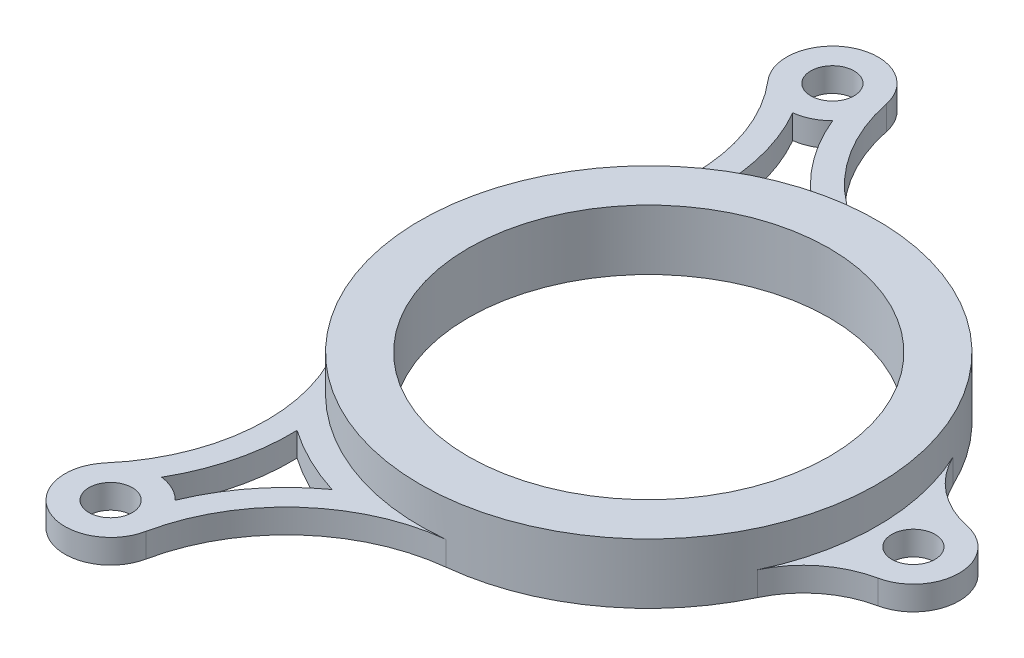
ISO-10303-21;
HEADER;
FILE_DESCRIPTION(('STEP AP214'),'2;1');
FILE_NAME('part.step','',(''),(''),'','','');
FILE_SCHEMA(('AUTOMOTIVE_DESIGN { 1 0 10303 214 1 1 1 1 }'));
ENDSEC;
DATA;
#1=APPLICATION_CONTEXT('core data for automotive mechanical design processes');
#2=APPLICATION_PROTOCOL_DEFINITION('international standard','automotive_design',2000,#1);
#3=PRODUCT_CONTEXT('',#1,'mechanical');
#4=PRODUCT('Part','Part','',(#3));
#5=PRODUCT_RELATED_PRODUCT_CATEGORY('part','',(#4));
#6=PRODUCT_DEFINITION_FORMATION('','',#4);
#7=PRODUCT_DEFINITION_CONTEXT('part definition',#1,'design');
#8=PRODUCT_DEFINITION('design','',#6,#7);
#9=PRODUCT_DEFINITION_SHAPE('','',#8);
#10=(LENGTH_UNIT() NAMED_UNIT(*) SI_UNIT(.MILLI.,.METRE.));
#11=(NAMED_UNIT(*) PLANE_ANGLE_UNIT() SI_UNIT($,.RADIAN.));
#12=(NAMED_UNIT(*) SI_UNIT($,.STERADIAN.) SOLID_ANGLE_UNIT());
#13=UNCERTAINTY_MEASURE_WITH_UNIT(LENGTH_MEASURE(1.E-05),#10,'distance_accuracy_value','');
#14=(GEOMETRIC_REPRESENTATION_CONTEXT(3) GLOBAL_UNCERTAINTY_ASSIGNED_CONTEXT((#13)) GLOBAL_UNIT_ASSIGNED_CONTEXT((#10,
#11,#12)) REPRESENTATION_CONTEXT('',''));
#15=CARTESIAN_POINT('',(0.,0.,0.));
#16=DIRECTION('',(0.,0.,1.));
#17=DIRECTION('',(1.,0.,0.));
#18=AXIS2_PLACEMENT_3D('',#15,#16,#17);
#19=CARTESIAN_POINT('',(0.,6.35,0.));
#20=DIRECTION('',(0.,1.,0.));
#21=DIRECTION('',(0.,0.,1.));
#22=AXIS2_PLACEMENT_3D('',#19,#20,#21);
#23=PLANE('',#22);
#24=CARTESIAN_POINT('',(0.,6.35,0.));
#25=DIRECTION('',(0.,1.,0.));
#26=DIRECTION('',(0.,0.,1.));
#27=AXIS2_PLACEMENT_3D('',#24,#25,#26);
#28=CIRCLE('',#27,24.13);
#29=CARTESIAN_POINT('',(0.,6.35,24.13));
#30=VERTEX_POINT('',#29);
#31=EDGE_CURVE('E50',#30,#30,#28,.T.);
#32=ORIENTED_EDGE('',*,*,#31,.T.);
#33=EDGE_LOOP('',(#32));
#34=FACE_BOUND('',#33,.T.);
#35=CARTESIAN_POINT('',(0.,6.35,0.));
#36=DIRECTION('',(0.,1.,0.));
#37=DIRECTION('',(0.,0.,1.));
#38=AXIS2_PLACEMENT_3D('',#35,#36,#37);
#39=CIRCLE('',#38,19.05);
#40=CARTESIAN_POINT('',(0.,6.35,19.05));
#41=VERTEX_POINT('',#40);
#42=EDGE_CURVE('E406',#41,#41,#39,.T.);
#43=ORIENTED_EDGE('',*,*,#42,.F.);
#44=EDGE_LOOP('',(#43));
#45=FACE_BOUND('',#44,.T.);
#46=ADVANCED_FACE('F41',(#34,#45),#23,.T.);
#47=CARTESIAN_POINT('',(0.,0.,0.));
#48=DIRECTION('',(0.,1.,0.));
#49=DIRECTION('',(0.,0.,1.));
#50=AXIS2_PLACEMENT_3D('',#47,#48,#49);
#51=PLANE('',#50);
#52=CARTESIAN_POINT('',(0.,0.,0.));
#53=DIRECTION('',(0.,1.,0.));
#54=DIRECTION('',(0.,0.,1.));
#55=AXIS2_PLACEMENT_3D('',#52,#53,#54);
#56=CIRCLE('',#55,24.13);
#57=CARTESIAN_POINT('',(21.8096202020202,0.,-10.3246000718494));
#58=VERTEX_POINT('',#57);
#59=CARTESIAN_POINT('',(2.61164424906791,0.,-23.9882515893991));
#60=VERTEX_POINT('',#59);
#61=EDGE_CURVE('E416',#58,#60,#56,.T.);
#62=ORIENTED_EDGE('',*,*,#61,.F.);
#63=CARTESIAN_POINT('',(30.9926181818182,0.,-14.6718001021018));
#64=DIRECTION('',(0.,1.,0.));
#65=DIRECTION('',(0.,0.,-1.));
#66=AXIS2_PLACEMENT_3D('',#63,#64,#65);
#67=CIRCLE('',#66,10.16);
#68=CARTESIAN_POINT('',(28.9230465331279,0.,-4.72481698203277));
#69=VERTEX_POINT('',#68);
#70=EDGE_CURVE('E385',#58,#69,#67,.T.);
#71=ORIENTED_EDGE('',*,*,#70,.T.);
#72=CARTESIAN_POINT('',(27.94,0.,0.));
#73=DIRECTION('',(0.,-1.,0.));
#74=DIRECTION('',(0.,0.,-1.));
#75=AXIS2_PLACEMENT_3D('',#72,#73,#74);
#76=CIRCLE('',#75,4.826);
#77=CARTESIAN_POINT('',(28.9230465331279,0.,4.72481698203277));
#78=VERTEX_POINT('',#77);
#79=EDGE_CURVE('E373',#69,#78,#76,.T.);
#80=ORIENTED_EDGE('',*,*,#79,.T.);
#81=CARTESIAN_POINT('',(30.9926181818182,0.,14.6718001021018));
#82=DIRECTION('',(0.,1.,0.));
#83=DIRECTION('',(0.,0.,-1.));
#84=AXIS2_PLACEMENT_3D('',#81,#82,#83);
#85=CIRCLE('',#84,10.16);
#86=CARTESIAN_POINT('',(21.8096202020202,0.,10.3246000718494));
#87=VERTEX_POINT('',#86);
#88=EDGE_CURVE('E364',#78,#87,#85,.T.);
#89=ORIENTED_EDGE('',*,*,#88,.T.);
#90=CARTESIAN_POINT('',(2.61164424906791,0.,23.9882515893991));
#91=VERTEX_POINT('',#90);
#92=EDGE_CURVE('E410',#91,#87,#56,.T.);
#93=ORIENTED_EDGE('',*,*,#92,.F.);
#94=CARTESIAN_POINT('',(4.67346865622678,0.,42.9263449494511));
#95=DIRECTION('',(0.,-1.,0.));
#96=DIRECTION('',(0.,0.,-1.));
#97=AXIS2_PLACEMENT_3D('',#94,#95,#96);
#98=CIRCLE('',#97,19.05);
#99=CARTESIAN_POINT('',(-13.9832669737414,0.,39.0755378089316));
#100=VERTEX_POINT('',#99);
#101=EDGE_CURVE('E327',#100,#91,#98,.T.);
#102=ORIENTED_EDGE('',*,*,#101,.F.);
#103=CARTESIAN_POINT('',(-18.70964,0.,38.1));
#104=DIRECTION('',(0.,-1.,0.));
#105=DIRECTION('',(0.,0.,-1.));
#106=AXIS2_PLACEMENT_3D('',#103,#104,#105);
#107=CIRCLE('',#106,4.826);
#108=CARTESIAN_POINT('',(-22.3713617674814,0.,34.9564240588857));
#109=VERTEX_POINT('',#108);
#110=EDGE_CURVE('E315',#100,#109,#107,.T.);
#111=ORIENTED_EDGE('',*,*,#110,.T.);
#112=CARTESIAN_POINT('',(-36.8255266391186,0.,22.5475716597502));
#113=DIRECTION('',(0.,-1.,0.));
#114=DIRECTION('',(0.,0.,-1.));
#115=AXIS2_PLACEMENT_3D('',#112,#113,#114);
#116=CIRCLE('',#115,19.05);
#117=CARTESIAN_POINT('',(-20.5789707689192,0.,12.6001135745663));
#118=VERTEX_POINT('',#117);
#119=EDGE_CURVE('E323',#118,#109,#116,.T.);
#120=ORIENTED_EDGE('',*,*,#119,.F.);
#121=CARTESIAN_POINT('',(-20.5789707689192,0.,-12.6001135745663));
#122=VERTEX_POINT('',#121);
#123=EDGE_CURVE('E418',#122,#118,#56,.T.);
#124=ORIENTED_EDGE('',*,*,#123,.F.);
#125=CARTESIAN_POINT('',(-36.8255266391186,0.,-22.5475716597502));
#126=DIRECTION('',(0.,1.,0.));
#127=DIRECTION('',(0.,0.,1.));
#128=AXIS2_PLACEMENT_3D('',#125,#126,#127);
#129=CIRCLE('',#128,19.05);
#130=CARTESIAN_POINT('',(-22.3713617674814,0.,-34.9564240588857));
#131=VERTEX_POINT('',#130);
#132=EDGE_CURVE('E212',#122,#131,#129,.T.);
#133=ORIENTED_EDGE('',*,*,#132,.T.);
#134=CARTESIAN_POINT('',(-18.70964,0.,-38.1));
#135=DIRECTION('',(0.,1.,0.));
#136=DIRECTION('',(0.,0.,1.));
#137=AXIS2_PLACEMENT_3D('',#134,#135,#136);
#138=CIRCLE('',#137,4.826);
#139=CARTESIAN_POINT('',(-13.9832669737414,0.,-39.0755378089316));
#140=VERTEX_POINT('',#139);
#141=EDGE_CURVE('E245',#140,#131,#138,.T.);
#142=ORIENTED_EDGE('',*,*,#141,.F.);
#143=CARTESIAN_POINT('',(4.67346865622678,0.,-42.9263449494511));
#144=DIRECTION('',(0.,1.,0.));
#145=DIRECTION('',(0.,0.,1.));
#146=AXIS2_PLACEMENT_3D('',#143,#144,#145);
#147=CIRCLE('',#146,19.05);
#148=EDGE_CURVE('E246',#140,#60,#147,.T.);
#149=ORIENTED_EDGE('',*,*,#148,.T.);
#150=EDGE_LOOP('',(#62,#71,#80,#89,#93,#102,#111,#120,#124,#133,#142,#149));
#151=FACE_BOUND('',#150,.T.);
#152=CARTESIAN_POINT('',(0.,0.,0.));
#153=DIRECTION('',(0.,1.,0.));
#154=DIRECTION('',(0.,0.,1.));
#155=AXIS2_PLACEMENT_3D('',#152,#153,#154);
#156=CIRCLE('',#155,19.05);
#157=CARTESIAN_POINT('',(0.,0.,19.05));
#158=VERTEX_POINT('',#157);
#159=EDGE_CURVE('E395',#158,#158,#156,.T.);
#160=ORIENTED_EDGE('',*,*,#159,.T.);
#161=EDGE_LOOP('',(#160));
#162=FACE_BOUND('',#161,.T.);
#163=CARTESIAN_POINT('',(27.94,0.,0.));
#164=DIRECTION('',(0.,-1.,0.));
#165=DIRECTION('',(0.,0.,-1.));
#166=AXIS2_PLACEMENT_3D('',#163,#164,#165);
#167=CIRCLE('',#166,2.286);
#168=CARTESIAN_POINT('',(27.94,0.,-2.286));
#169=VERTEX_POINT('',#168);
#170=EDGE_CURVE('E337',#169,#169,#167,.T.);
#171=ORIENTED_EDGE('',*,*,#170,.F.);
#172=EDGE_LOOP('',(#171));
#173=FACE_BOUND('',#172,.T.);
#174=CARTESIAN_POINT('',(-36.8255266391186,0.,22.5475716597502));
#175=DIRECTION('',(0.,-1.,0.));
#176=DIRECTION('',(0.,0.,-1.));
#177=AXIS2_PLACEMENT_3D('',#174,#175,#176);
#178=CIRCLE('',#177,21.59);
#179=CARTESIAN_POINT('',(-15.2457644287689,0.,21.8827687229583));
#180=VERTEX_POINT('',#179);
#181=CARTESIAN_POINT('',(-18.1100697208637,0.,33.311389399797));
#182=VERTEX_POINT('',#181);
#183=EDGE_CURVE('E256',#180,#182,#178,.T.);
#184=ORIENTED_EDGE('',*,*,#183,.T.);
#185=CARTESIAN_POINT('',(-15.286943188986,0.,34.6977327353844));
#186=VERTEX_POINT('',#185);
#187=EDGE_CURVE('E310',#182,#186,#107,.T.);
#188=ORIENTED_EDGE('',*,*,#187,.T.);
#189=CARTESIAN_POINT('',(4.67346865622678,0.,42.9263449494511));
#190=DIRECTION('',(0.,-1.,0.));
#191=DIRECTION('',(0.,0.,-1.));
#192=AXIS2_PLACEMENT_3D('',#189,#190,#191);
#193=CIRCLE('',#192,21.59);
#194=CARTESIAN_POINT('',(-7.99462004043614,0.,25.4435640272556));
#195=VERTEX_POINT('',#194);
#196=EDGE_CURVE('E314',#186,#195,#193,.T.);
#197=ORIENTED_EDGE('',*,*,#196,.T.);
#198=CARTESIAN_POINT('',(0.,0.,0.));
#199=DIRECTION('',(0.,-1.,0.));
#200=DIRECTION('',(0.,0.,-1.));
#201=AXIS2_PLACEMENT_3D('',#198,#199,#200);
#202=CIRCLE('',#201,26.67);
#203=EDGE_CURVE('E319',#195,#180,#202,.T.);
#204=ORIENTED_EDGE('',*,*,#203,.T.);
#205=EDGE_LOOP('',(#184,#188,#197,#204));
#206=FACE_BOUND('',#205,.T.);
#207=CARTESIAN_POINT('',(-18.70964,0.,38.1));
#208=DIRECTION('',(0.,-1.,0.));
#209=DIRECTION('',(0.,0.,-1.));
#210=AXIS2_PLACEMENT_3D('',#207,#208,#209);
#211=CIRCLE('',#210,2.286);
#212=CARTESIAN_POINT('',(-18.70964,0.,35.814));
#213=VERTEX_POINT('',#212);
#214=EDGE_CURVE('E278',#213,#213,#211,.T.);
#215=ORIENTED_EDGE('',*,*,#214,.F.);
#216=EDGE_LOOP('',(#215));
#217=FACE_BOUND('',#216,.T.);
#218=CARTESIAN_POINT('',(-36.8255266391186,0.,-22.5475716597502));
#219=DIRECTION('',(0.,1.,0.));
#220=DIRECTION('',(0.,0.,1.));
#221=AXIS2_PLACEMENT_3D('',#218,#219,#220);
#222=CIRCLE('',#221,21.59);
#223=CARTESIAN_POINT('',(-15.2457644287689,0.,-21.8827687229583));
#224=VERTEX_POINT('',#223);
#225=CARTESIAN_POINT('',(-18.1100697208637,0.,-33.311389399797));
#226=VERTEX_POINT('',#225);
#227=EDGE_CURVE('E234',#224,#226,#222,.T.);
#228=ORIENTED_EDGE('',*,*,#227,.F.);
#229=CARTESIAN_POINT('',(0.,0.,0.));
#230=DIRECTION('',(0.,1.,0.));
#231=DIRECTION('',(0.,0.,1.));
#232=AXIS2_PLACEMENT_3D('',#229,#230,#231);
#233=CIRCLE('',#232,26.67);
#234=CARTESIAN_POINT('',(-7.99462004043614,0.,-25.4435640272556));
#235=VERTEX_POINT('',#234);
#236=EDGE_CURVE('E196',#235,#224,#233,.T.);
#237=ORIENTED_EDGE('',*,*,#236,.F.);
#238=CARTESIAN_POINT('',(4.67346865622678,0.,-42.9263449494511));
#239=DIRECTION('',(0.,1.,0.));
#240=DIRECTION('',(0.,0.,1.));
#241=AXIS2_PLACEMENT_3D('',#238,#239,#240);
#242=CIRCLE('',#241,21.59);
#243=CARTESIAN_POINT('',(-15.286943188986,0.,-34.6977327353844));
#244=VERTEX_POINT('',#243);
#245=EDGE_CURVE('E239',#244,#235,#242,.T.);
#246=ORIENTED_EDGE('',*,*,#245,.F.);
#247=EDGE_CURVE('E242',#226,#244,#138,.T.);
#248=ORIENTED_EDGE('',*,*,#247,.F.);
#249=EDGE_LOOP('',(#228,#237,#246,#248));
#250=FACE_BOUND('',#249,.T.);
#251=CARTESIAN_POINT('',(-18.70964,0.,-38.1));
#252=DIRECTION('',(0.,1.,0.));
#253=DIRECTION('',(0.,0.,1.));
#254=AXIS2_PLACEMENT_3D('',#251,#252,#253);
#255=CIRCLE('',#254,2.286);
#256=CARTESIAN_POINT('',(-18.70964,0.,-35.814));
#257=VERTEX_POINT('',#256);
#258=EDGE_CURVE('E208',#257,#257,#255,.T.);
#259=ORIENTED_EDGE('',*,*,#258,.T.);
#260=EDGE_LOOP('',(#259));
#261=FACE_BOUND('',#260,.T.);
#262=ADVANCED_FACE('F429',(#151,#162,#173,#206,#217,#250,#261),#51,.F.);
#263=CARTESIAN_POINT('',(0.,6.35,0.));
#264=DIRECTION('',(0.,-1.,0.));
#265=DIRECTION('',(0.,0.,-1.));
#266=AXIS2_PLACEMENT_3D('',#263,#264,#265);
#267=CYLINDRICAL_SURFACE('',#266,24.13);
#268=CARTESIAN_POINT('',(0.,2.54,0.));
#269=DIRECTION('',(0.,1.,0.));
#270=DIRECTION('',(0.,0.,1.));
#271=AXIS2_PLACEMENT_3D('',#268,#269,#270);
#272=CIRCLE('',#271,24.13);
#273=CARTESIAN_POINT('',(2.61164424906791,2.54,-23.9882515893991));
#274=VERTEX_POINT('',#273);
#275=CARTESIAN_POINT('',(-20.5789707689192,2.54,-12.6001135745663));
#276=VERTEX_POINT('',#275);
#277=EDGE_CURVE('E61',#274,#276,#272,.T.);
#278=ORIENTED_EDGE('',*,*,#277,.T.);
#279=DIRECTION('',(0.,-1.,0.));
#280=VECTOR('',#279,1.);
#281=CARTESIAN_POINT('',(-20.5789707689192,2.54,-12.6001135745663));
#282=LINE('',#281,#280);
#283=EDGE_CURVE('E257',#276,#122,#282,.T.);
#284=ORIENTED_EDGE('',*,*,#283,.T.);
#285=ORIENTED_EDGE('',*,*,#123,.T.);
#286=DIRECTION('',(0.,-1.,0.));
#287=VECTOR('',#286,1.);
#288=CARTESIAN_POINT('',(-20.5789707689192,2.54,12.6001135745663));
#289=LINE('',#288,#287);
#290=CARTESIAN_POINT('',(-20.5789707689192,2.54,12.6001135745663));
#291=VERTEX_POINT('',#290);
#292=EDGE_CURVE('E342',#291,#118,#289,.T.);
#293=ORIENTED_EDGE('',*,*,#292,.F.);
#294=CARTESIAN_POINT('',(0.,2.54,0.));
#295=DIRECTION('',(0.,-1.,0.));
#296=DIRECTION('',(0.,0.,-1.));
#297=AXIS2_PLACEMENT_3D('',#294,#295,#296);
#298=CIRCLE('',#297,24.13);
#299=CARTESIAN_POINT('',(2.61164424906791,2.54,23.9882515893991));
#300=VERTEX_POINT('',#299);
#301=EDGE_CURVE('E294',#300,#291,#298,.T.);
#302=ORIENTED_EDGE('',*,*,#301,.F.);
#303=DIRECTION('',(0.,-1.,0.));
#304=VECTOR('',#303,1.);
#305=CARTESIAN_POINT('',(2.61164424906791,2.54,23.9882515893991));
#306=LINE('',#305,#304);
#307=EDGE_CURVE('E338',#300,#91,#306,.T.);
#308=ORIENTED_EDGE('',*,*,#307,.T.);
#309=ORIENTED_EDGE('',*,*,#92,.T.);
#310=DIRECTION('',(0.,-1.,0.));
#311=VECTOR('',#310,1.);
#312=CARTESIAN_POINT('',(21.8096202020202,2.54,10.3246000718494));
#313=LINE('',#312,#311);
#314=CARTESIAN_POINT('',(21.8096202020202,2.54,10.3246000718494));
#315=VERTEX_POINT('',#314);
#316=EDGE_CURVE('E381',#315,#87,#313,.T.);
#317=ORIENTED_EDGE('',*,*,#316,.F.);
#318=CARTESIAN_POINT('',(0.,2.54,0.));
#319=DIRECTION('',(0.,-1.,0.));
#320=DIRECTION('',(0.,0.,-1.));
#321=AXIS2_PLACEMENT_3D('',#318,#319,#320);
#322=CIRCLE('',#321,24.13);
#323=CARTESIAN_POINT('',(21.8096202020202,2.54,-10.3246000718494));
#324=VERTEX_POINT('',#323);
#325=EDGE_CURVE('E11',#324,#315,#322,.T.);
#326=ORIENTED_EDGE('',*,*,#325,.F.);
#327=DIRECTION('',(0.,-1.,0.));
#328=VECTOR('',#327,1.);
#329=CARTESIAN_POINT('',(21.8096202020202,2.54,-10.3246000718494));
#330=LINE('',#329,#328);
#331=EDGE_CURVE('E399',#324,#58,#330,.T.);
#332=ORIENTED_EDGE('',*,*,#331,.T.);
#333=ORIENTED_EDGE('',*,*,#61,.T.);
#334=DIRECTION('',(0.,-1.,0.));
#335=VECTOR('',#334,1.);
#336=CARTESIAN_POINT('',(2.61164424906791,2.54,-23.9882515893991));
#337=LINE('',#336,#335);
#338=EDGE_CURVE('E57',#274,#60,#337,.T.);
#339=ORIENTED_EDGE('',*,*,#338,.F.);
#340=EDGE_LOOP('',(#278,#284,#285,#293,#302,#308,#309,#317,#326,#332,#333,#339));
#341=FACE_BOUND('',#340,.T.);
#342=ORIENTED_EDGE('',*,*,#31,.F.);
#343=EDGE_LOOP('',(#342));
#344=FACE_BOUND('',#343,.T.);
#345=ADVANCED_FACE('F43',(#341,#344),#267,.T.);
#346=CARTESIAN_POINT('',(0.,6.35,0.));
#347=DIRECTION('',(0.,-1.,0.));
#348=DIRECTION('',(0.,0.,-1.));
#349=AXIS2_PLACEMENT_3D('',#346,#347,#348);
#350=CYLINDRICAL_SURFACE('',#349,19.05);
#351=ORIENTED_EDGE('',*,*,#42,.T.);
#352=EDGE_LOOP('',(#351));
#353=FACE_BOUND('',#352,.T.);
#354=ORIENTED_EDGE('',*,*,#159,.F.);
#355=EDGE_LOOP('',(#354));
#356=FACE_BOUND('',#355,.T.);
#357=ADVANCED_FACE('F462',(#353,#356),#350,.F.);
#358=CARTESIAN_POINT('',(30.9926181818182,2.54,14.6718001021018));
#359=DIRECTION('',(0.,-1.,0.));
#360=DIRECTION('',(0.,0.,-1.));
#361=AXIS2_PLACEMENT_3D('',#358,#359,#360);
#362=CYLINDRICAL_SURFACE('',#361,10.16);
#363=ORIENTED_EDGE('',*,*,#88,.F.);
#364=DIRECTION('',(0.,-1.,0.));
#365=VECTOR('',#364,1.);
#366=CARTESIAN_POINT('',(28.9230465331279,2.54,4.72481698203277));
#367=LINE('',#366,#365);
#368=CARTESIAN_POINT('',(28.9230465331279,2.54,4.72481698203277));
#369=VERTEX_POINT('',#368);
#370=EDGE_CURVE('E392',#369,#78,#367,.T.);
#371=ORIENTED_EDGE('',*,*,#370,.F.);
#372=CARTESIAN_POINT('',(30.9926181818182,2.54,14.6718001021018));
#373=DIRECTION('',(0.,1.,0.));
#374=DIRECTION('',(0.,0.,-1.));
#375=AXIS2_PLACEMENT_3D('',#372,#373,#374);
#376=CIRCLE('',#375,10.16);
#377=EDGE_CURVE('E368',#369,#315,#376,.T.);
#378=ORIENTED_EDGE('',*,*,#377,.T.);
#379=ORIENTED_EDGE('',*,*,#316,.T.);
#380=EDGE_LOOP('',(#363,#371,#378,#379));
#381=FACE_BOUND('',#380,.T.);
#382=ADVANCED_FACE('F427',(#381),#362,.F.);
#383=CARTESIAN_POINT('',(27.94,2.54,0.));
#384=DIRECTION('',(0.,-1.,0.));
#385=DIRECTION('',(0.,0.,-1.));
#386=AXIS2_PLACEMENT_3D('',#383,#384,#385);
#387=CYLINDRICAL_SURFACE('',#386,4.826);
#388=ORIENTED_EDGE('',*,*,#79,.F.);
#389=DIRECTION('',(0.,-1.,0.));
#390=VECTOR('',#389,1.);
#391=CARTESIAN_POINT('',(28.9230465331279,2.54,-4.72481698203277));
#392=LINE('',#391,#390);
#393=CARTESIAN_POINT('',(28.9230465331279,2.54,-4.72481698203277));
#394=VERTEX_POINT('',#393);
#395=EDGE_CURVE('E396',#394,#69,#392,.T.);
#396=ORIENTED_EDGE('',*,*,#395,.F.);
#397=CARTESIAN_POINT('',(27.94,2.54,0.));
#398=DIRECTION('',(0.,-1.,0.));
#399=DIRECTION('',(0.,0.,-1.));
#400=AXIS2_PLACEMENT_3D('',#397,#398,#399);
#401=CIRCLE('',#400,4.826);
#402=EDGE_CURVE('E377',#394,#369,#401,.T.);
#403=ORIENTED_EDGE('',*,*,#402,.T.);
#404=ORIENTED_EDGE('',*,*,#370,.T.);
#405=EDGE_LOOP('',(#388,#396,#403,#404));
#406=FACE_BOUND('',#405,.T.);
#407=ADVANCED_FACE('F434',(#406),#387,.T.);
#408=CARTESIAN_POINT('',(30.9926181818182,2.54,-14.6718001021018));
#409=DIRECTION('',(0.,-1.,0.));
#410=DIRECTION('',(0.,0.,-1.));
#411=AXIS2_PLACEMENT_3D('',#408,#409,#410);
#412=CYLINDRICAL_SURFACE('',#411,10.16);
#413=ORIENTED_EDGE('',*,*,#70,.F.);
#414=ORIENTED_EDGE('',*,*,#331,.F.);
#415=CARTESIAN_POINT('',(30.9926181818182,2.54,-14.6718001021018));
#416=DIRECTION('',(0.,1.,0.));
#417=DIRECTION('',(0.,0.,-1.));
#418=AXIS2_PLACEMENT_3D('',#415,#416,#417);
#419=CIRCLE('',#418,10.16);
#420=EDGE_CURVE('E372',#324,#394,#419,.T.);
#421=ORIENTED_EDGE('',*,*,#420,.T.);
#422=ORIENTED_EDGE('',*,*,#395,.T.);
#423=EDGE_LOOP('',(#413,#414,#421,#422));
#424=FACE_BOUND('',#423,.T.);
#425=ADVANCED_FACE('F441',(#424),#412,.F.);
#426=CARTESIAN_POINT('',(30.9926181818182,2.54,14.6718001021018));
#427=DIRECTION('',(0.,-1.,0.));
#428=DIRECTION('',(0.,0.,-1.));
#429=AXIS2_PLACEMENT_3D('',#426,#427,#428);
#430=PLANE('',#429);
#431=CARTESIAN_POINT('',(27.94,2.54,0.));
#432=DIRECTION('',(0.,-1.,0.));
#433=DIRECTION('',(0.,0.,-1.));
#434=AXIS2_PLACEMENT_3D('',#431,#432,#433);
#435=CIRCLE('',#434,2.286);
#436=CARTESIAN_POINT('',(27.94,2.54,-2.286));
#437=VERTEX_POINT('',#436);
#438=EDGE_CURVE('E360',#437,#437,#435,.T.);
#439=ORIENTED_EDGE('',*,*,#438,.T.);
#440=EDGE_LOOP('',(#439));
#441=FACE_BOUND('',#440,.T.);
#442=ORIENTED_EDGE('',*,*,#420,.F.);
#443=ORIENTED_EDGE('',*,*,#325,.T.);
#444=ORIENTED_EDGE('',*,*,#377,.F.);
#445=ORIENTED_EDGE('',*,*,#402,.F.);
#446=EDGE_LOOP('',(#442,#443,#444,#445));
#447=FACE_BOUND('',#446,.T.);
#448=ADVANCED_FACE('F438',(#441,#447),#430,.F.);
#449=CARTESIAN_POINT('',(27.94,2.54,0.));
#450=DIRECTION('',(0.,-1.,0.));
#451=DIRECTION('',(0.,0.,-1.));
#452=AXIS2_PLACEMENT_3D('',#449,#450,#451);
#453=CYLINDRICAL_SURFACE('',#452,2.286);
#454=ORIENTED_EDGE('',*,*,#438,.F.);
#455=EDGE_LOOP('',(#454));
#456=FACE_BOUND('',#455,.T.);
#457=ORIENTED_EDGE('',*,*,#170,.T.);
#458=EDGE_LOOP('',(#457));
#459=FACE_BOUND('',#458,.T.);
#460=ADVANCED_FACE('F448',(#456,#459),#453,.F.);
#461=CARTESIAN_POINT('',(-18.70964,2.54,38.1));
#462=DIRECTION('',(0.,-1.,0.));
#463=DIRECTION('',(0.,0.,-1.));
#464=AXIS2_PLACEMENT_3D('',#461,#462,#463);
#465=CYLINDRICAL_SURFACE('',#464,4.826);
#466=ORIENTED_EDGE('',*,*,#110,.F.);
#467=DIRECTION('',(0.,-1.,0.));
#468=VECTOR('',#467,1.);
#469=CARTESIAN_POINT('',(-13.9832669737414,2.54,39.0755378089316));
#470=LINE('',#469,#468);
#471=CARTESIAN_POINT('',(-13.9832669737414,2.54,39.0755378089316));
#472=VERTEX_POINT('',#471);
#473=EDGE_CURVE('E334',#472,#100,#470,.T.);
#474=ORIENTED_EDGE('',*,*,#473,.F.);
#475=CARTESIAN_POINT('',(-18.70964,2.54,38.1));
#476=DIRECTION('',(0.,-1.,0.));
#477=DIRECTION('',(0.,0.,-1.));
#478=AXIS2_PLACEMENT_3D('',#475,#476,#477);
#479=CIRCLE('',#478,4.826);
#480=CARTESIAN_POINT('',(-22.3713617674814,2.54,34.9564240588857));
#481=VERTEX_POINT('',#480);
#482=EDGE_CURVE('E283',#472,#481,#479,.T.);
#483=ORIENTED_EDGE('',*,*,#482,.T.);
#484=DIRECTION('',(0.,-1.,0.));
#485=VECTOR('',#484,1.);
#486=CARTESIAN_POINT('',(-22.3713617674814,2.54,34.9564240588857));
#487=LINE('',#486,#485);
#488=EDGE_CURVE('E346',#481,#109,#487,.T.);
#489=ORIENTED_EDGE('',*,*,#488,.T.);
#490=EDGE_LOOP('',(#466,#474,#483,#489));
#491=FACE_BOUND('',#490,.T.);
#492=ADVANCED_FACE('F494',(#491),#465,.T.);
#493=CARTESIAN_POINT('',(4.67346865622678,2.54,42.9263449494511));
#494=DIRECTION('',(0.,-1.,0.));
#495=DIRECTION('',(0.,0.,-1.));
#496=AXIS2_PLACEMENT_3D('',#493,#494,#495);
#497=CYLINDRICAL_SURFACE('',#496,19.05);
#498=ORIENTED_EDGE('',*,*,#101,.T.);
#499=ORIENTED_EDGE('',*,*,#307,.F.);
#500=CARTESIAN_POINT('',(4.67346865622678,2.54,42.9263449494511));
#501=DIRECTION('',(0.,-1.,0.));
#502=DIRECTION('',(0.,0.,-1.));
#503=AXIS2_PLACEMENT_3D('',#500,#501,#502);
#504=CIRCLE('',#503,19.05);
#505=EDGE_CURVE('E298',#472,#300,#504,.T.);
#506=ORIENTED_EDGE('',*,*,#505,.F.);
#507=ORIENTED_EDGE('',*,*,#473,.T.);
#508=EDGE_LOOP('',(#498,#499,#506,#507));
#509=FACE_BOUND('',#508,.T.);
#510=ADVANCED_FACE('F505',(#509),#497,.F.);
#511=CARTESIAN_POINT('',(-36.8255266391186,2.54,22.5475716597502));
#512=DIRECTION('',(0.,-1.,0.));
#513=DIRECTION('',(0.,0.,-1.));
#514=AXIS2_PLACEMENT_3D('',#511,#512,#513);
#515=CYLINDRICAL_SURFACE('',#514,21.59);
#516=ORIENTED_EDGE('',*,*,#183,.F.);
#517=DIRECTION('',(0.,-1.,0.));
#518=VECTOR('',#517,1.);
#519=CARTESIAN_POINT('',(-15.2457644287689,2.54,21.8827687229583));
#520=LINE('',#519,#518);
#521=CARTESIAN_POINT('',(-15.2457644287689,2.54,21.8827687229583));
#522=VERTEX_POINT('',#521);
#523=EDGE_CURVE('E349',#522,#180,#520,.T.);
#524=ORIENTED_EDGE('',*,*,#523,.F.);
#525=CARTESIAN_POINT('',(-36.8255266391186,2.54,22.5475716597502));
#526=DIRECTION('',(0.,-1.,0.));
#527=DIRECTION('',(0.,0.,-1.));
#528=AXIS2_PLACEMENT_3D('',#525,#526,#527);
#529=CIRCLE('',#528,21.59);
#530=CARTESIAN_POINT('',(-18.1100697208637,2.54,33.311389399797));
#531=VERTEX_POINT('',#530);
#532=EDGE_CURVE('E273',#522,#531,#529,.T.);
#533=ORIENTED_EDGE('',*,*,#532,.T.);
#534=DIRECTION('',(0.,-1.,0.));
#535=VECTOR('',#534,1.);
#536=CARTESIAN_POINT('',(-18.1100697208637,2.54,33.311389399797));
#537=LINE('',#536,#535);
#538=EDGE_CURVE('E306',#531,#182,#537,.T.);
#539=ORIENTED_EDGE('',*,*,#538,.T.);
#540=EDGE_LOOP('',(#516,#524,#533,#539));
#541=FACE_BOUND('',#540,.T.);
#542=ADVANCED_FACE('F517',(#541),#515,.T.);
#543=CARTESIAN_POINT('',(0.,2.54,0.));
#544=DIRECTION('',(0.,-1.,0.));
#545=DIRECTION('',(0.,0.,-1.));
#546=AXIS2_PLACEMENT_3D('',#543,#544,#545);
#547=CYLINDRICAL_SURFACE('',#546,26.67);
#548=ORIENTED_EDGE('',*,*,#203,.F.);
#549=DIRECTION('',(0.,-1.,0.));
#550=VECTOR('',#549,1.);
#551=CARTESIAN_POINT('',(-7.99462004043614,2.54,25.4435640272556));
#552=LINE('',#551,#550);
#553=CARTESIAN_POINT('',(-7.99462004043614,2.54,25.4435640272556));
#554=VERTEX_POINT('',#553);
#555=EDGE_CURVE('E352',#554,#195,#552,.T.);
#556=ORIENTED_EDGE('',*,*,#555,.F.);
#557=CARTESIAN_POINT('',(0.,2.54,0.));
#558=DIRECTION('',(0.,-1.,0.));
#559=DIRECTION('',(0.,0.,-1.));
#560=AXIS2_PLACEMENT_3D('',#557,#558,#559);
#561=CIRCLE('',#560,26.67);
#562=EDGE_CURVE('E287',#554,#522,#561,.T.);
#563=ORIENTED_EDGE('',*,*,#562,.T.);
#564=ORIENTED_EDGE('',*,*,#523,.T.);
#565=EDGE_LOOP('',(#548,#556,#563,#564));
#566=FACE_BOUND('',#565,.T.);
#567=ADVANCED_FACE('F527',(#566),#547,.T.);
#568=CARTESIAN_POINT('',(4.67346865622678,2.54,42.9263449494511));
#569=DIRECTION('',(0.,-1.,0.));
#570=DIRECTION('',(0.,0.,-1.));
#571=AXIS2_PLACEMENT_3D('',#568,#569,#570);
#572=CYLINDRICAL_SURFACE('',#571,21.59);
#573=ORIENTED_EDGE('',*,*,#196,.F.);
#574=DIRECTION('',(0.,-1.,0.));
#575=VECTOR('',#574,1.);
#576=CARTESIAN_POINT('',(-15.286943188986,2.54,34.6977327353844));
#577=LINE('',#576,#575);
#578=CARTESIAN_POINT('',(-15.286943188986,2.54,34.6977327353844));
#579=VERTEX_POINT('',#578);
#580=EDGE_CURVE('E355',#579,#186,#577,.T.);
#581=ORIENTED_EDGE('',*,*,#580,.F.);
#582=CARTESIAN_POINT('',(4.67346865622678,2.54,42.9263449494511));
#583=DIRECTION('',(0.,-1.,0.));
#584=DIRECTION('',(0.,0.,-1.));
#585=AXIS2_PLACEMENT_3D('',#582,#583,#584);
#586=CIRCLE('',#585,21.59);
#587=EDGE_CURVE('E282',#579,#554,#586,.T.);
#588=ORIENTED_EDGE('',*,*,#587,.T.);
#589=ORIENTED_EDGE('',*,*,#555,.T.);
#590=EDGE_LOOP('',(#573,#581,#588,#589));
#591=FACE_BOUND('',#590,.T.);
#592=ADVANCED_FACE('F537',(#591),#572,.T.);
#593=CARTESIAN_POINT('',(-36.8255266391186,2.54,22.5475716597502));
#594=DIRECTION('',(0.,-1.,0.));
#595=DIRECTION('',(0.,0.,-1.));
#596=AXIS2_PLACEMENT_3D('',#593,#594,#595);
#597=CYLINDRICAL_SURFACE('',#596,19.05);
#598=ORIENTED_EDGE('',*,*,#119,.T.);
#599=ORIENTED_EDGE('',*,*,#488,.F.);
#600=CARTESIAN_POINT('',(-36.8255266391186,2.54,22.5475716597502));
#601=DIRECTION('',(0.,-1.,0.));
#602=DIRECTION('',(0.,0.,-1.));
#603=AXIS2_PLACEMENT_3D('',#600,#601,#602);
#604=CIRCLE('',#603,19.05);
#605=EDGE_CURVE('E291',#291,#481,#604,.T.);
#606=ORIENTED_EDGE('',*,*,#605,.F.);
#607=ORIENTED_EDGE('',*,*,#292,.T.);
#608=EDGE_LOOP('',(#598,#599,#606,#607));
#609=FACE_BOUND('',#608,.T.);
#610=ADVANCED_FACE('F547',(#609),#597,.F.);
#611=ORIENTED_EDGE('',*,*,#187,.F.);
#612=ORIENTED_EDGE('',*,*,#538,.F.);
#613=EDGE_CURVE('E277',#531,#579,#479,.T.);
#614=ORIENTED_EDGE('',*,*,#613,.T.);
#615=ORIENTED_EDGE('',*,*,#580,.T.);
#616=EDGE_LOOP('',(#611,#612,#614,#615));
#617=FACE_BOUND('',#616,.T.);
#618=ADVANCED_FACE('F508',(#617),#465,.T.);
#619=CARTESIAN_POINT('',(-18.70964,2.54,38.1));
#620=DIRECTION('',(0.,-1.,0.));
#621=DIRECTION('',(0.,0.,-1.));
#622=AXIS2_PLACEMENT_3D('',#619,#620,#621);
#623=CYLINDRICAL_SURFACE('',#622,2.286);
#624=CARTESIAN_POINT('',(-18.70964,2.54,38.1));
#625=DIRECTION('',(0.,-1.,0.));
#626=DIRECTION('',(0.,0.,-1.));
#627=AXIS2_PLACEMENT_3D('',#624,#625,#626);
#628=CIRCLE('',#627,2.286);
#629=CARTESIAN_POINT('',(-18.70964,2.54,35.814));
#630=VERTEX_POINT('',#629);
#631=EDGE_CURVE('E302',#630,#630,#628,.T.);
#632=ORIENTED_EDGE('',*,*,#631,.F.);
#633=EDGE_LOOP('',(#632));
#634=FACE_BOUND('',#633,.T.);
#635=ORIENTED_EDGE('',*,*,#214,.T.);
#636=EDGE_LOOP('',(#635));
#637=FACE_BOUND('',#636,.T.);
#638=ADVANCED_FACE('F567',(#634,#637),#623,.F.);
#639=CARTESIAN_POINT('',(0.,2.54,0.));
#640=DIRECTION('',(0.,-1.,0.));
#641=DIRECTION('',(0.,0.,-1.));
#642=AXIS2_PLACEMENT_3D('',#639,#640,#641);
#643=PLANE('',#642);
#644=ORIENTED_EDGE('',*,*,#532,.F.);
#645=ORIENTED_EDGE('',*,*,#562,.F.);
#646=ORIENTED_EDGE('',*,*,#587,.F.);
#647=ORIENTED_EDGE('',*,*,#613,.F.);
#648=EDGE_LOOP('',(#644,#645,#646,#647));
#649=FACE_BOUND('',#648,.T.);
#650=ORIENTED_EDGE('',*,*,#482,.F.);
#651=ORIENTED_EDGE('',*,*,#505,.T.);
#652=ORIENTED_EDGE('',*,*,#301,.T.);
#653=ORIENTED_EDGE('',*,*,#605,.T.);
#654=EDGE_LOOP('',(#650,#651,#652,#653));
#655=FACE_BOUND('',#654,.T.);
#656=ORIENTED_EDGE('',*,*,#631,.T.);
#657=EDGE_LOOP('',(#656));
#658=FACE_BOUND('',#657,.T.);
#659=ADVANCED_FACE('F576',(#649,#655,#658),#643,.F.);
#660=CARTESIAN_POINT('',(-18.70964,2.54,-38.1));
#661=DIRECTION('',(0.,-1.,0.));
#662=DIRECTION('',(0.,0.,-1.));
#663=AXIS2_PLACEMENT_3D('',#660,#661,#662);
#664=CYLINDRICAL_SURFACE('',#663,4.826);
#665=ORIENTED_EDGE('',*,*,#141,.T.);
#666=DIRECTION('',(0.,-1.,0.));
#667=VECTOR('',#666,1.);
#668=CARTESIAN_POINT('',(-22.3713617674814,2.54,-34.9564240588857));
#669=LINE('',#668,#667);
#670=CARTESIAN_POINT('',(-22.3713617674814,2.54,-34.9564240588857));
#671=VERTEX_POINT('',#670);
#672=EDGE_CURVE('E253',#671,#131,#669,.T.);
#673=ORIENTED_EDGE('',*,*,#672,.F.);
#674=CARTESIAN_POINT('',(-18.70964,2.54,-38.1));
#675=DIRECTION('',(0.,1.,0.));
#676=DIRECTION('',(0.,0.,1.));
#677=AXIS2_PLACEMENT_3D('',#674,#675,#676);
#678=CIRCLE('',#677,4.826);
#679=CARTESIAN_POINT('',(-13.9832669737414,2.54,-39.0755378089316));
#680=VERTEX_POINT('',#679);
#681=EDGE_CURVE('E220',#680,#671,#678,.T.);
#682=ORIENTED_EDGE('',*,*,#681,.F.);
#683=DIRECTION('',(0.,-1.,0.));
#684=VECTOR('',#683,1.);
#685=CARTESIAN_POINT('',(-13.9832669737414,2.54,-39.0755378089316));
#686=LINE('',#685,#684);
#687=EDGE_CURVE('E262',#680,#140,#686,.T.);
#688=ORIENTED_EDGE('',*,*,#687,.T.);
#689=EDGE_LOOP('',(#665,#673,#682,#688));
#690=FACE_BOUND('',#689,.T.);
#691=ADVANCED_FACE('F586',(#690),#664,.T.);
#692=CARTESIAN_POINT('',(-36.8255266391186,2.54,-22.5475716597502));
#693=DIRECTION('',(0.,-1.,0.));
#694=DIRECTION('',(0.,0.,-1.));
#695=AXIS2_PLACEMENT_3D('',#692,#693,#694);
#696=CYLINDRICAL_SURFACE('',#695,19.05);
#697=ORIENTED_EDGE('',*,*,#132,.F.);
#698=ORIENTED_EDGE('',*,*,#283,.F.);
#699=CARTESIAN_POINT('',(-36.8255266391186,2.54,-22.5475716597502));
#700=DIRECTION('',(0.,1.,0.));
#701=DIRECTION('',(0.,0.,1.));
#702=AXIS2_PLACEMENT_3D('',#699,#700,#701);
#703=CIRCLE('',#702,19.05);
#704=EDGE_CURVE('E227',#276,#671,#703,.T.);
#705=ORIENTED_EDGE('',*,*,#704,.T.);
#706=ORIENTED_EDGE('',*,*,#672,.T.);
#707=EDGE_LOOP('',(#697,#698,#705,#706));
#708=FACE_BOUND('',#707,.T.);
#709=ADVANCED_FACE('F607',(#708),#696,.F.);
#710=CARTESIAN_POINT('',(-36.8255266391186,2.54,-22.5475716597502));
#711=DIRECTION('',(0.,-1.,0.));
#712=DIRECTION('',(0.,0.,-1.));
#713=AXIS2_PLACEMENT_3D('',#710,#711,#712);
#714=CYLINDRICAL_SURFACE('',#713,21.59);
#715=ORIENTED_EDGE('',*,*,#227,.T.);
#716=DIRECTION('',(0.,-1.,0.));
#717=VECTOR('',#716,1.);
#718=CARTESIAN_POINT('',(-18.1100697208637,2.54,-33.311389399797));
#719=LINE('',#718,#717);
#720=CARTESIAN_POINT('',(-18.1100697208637,2.54,-33.311389399797));
#721=VERTEX_POINT('',#720);
#722=EDGE_CURVE('E206',#721,#226,#719,.T.);
#723=ORIENTED_EDGE('',*,*,#722,.F.);
#724=CARTESIAN_POINT('',(-36.8255266391186,2.54,-22.5475716597502));
#725=DIRECTION('',(0.,1.,0.));
#726=DIRECTION('',(0.,0.,1.));
#727=AXIS2_PLACEMENT_3D('',#724,#725,#726);
#728=CIRCLE('',#727,21.59);
#729=CARTESIAN_POINT('',(-15.2457644287689,2.54,-21.8827687229583));
#730=VERTEX_POINT('',#729);
#731=EDGE_CURVE('E183',#730,#721,#728,.T.);
#732=ORIENTED_EDGE('',*,*,#731,.F.);
#733=DIRECTION('',(0.,-1.,0.));
#734=VECTOR('',#733,1.);
#735=CARTESIAN_POINT('',(-15.2457644287689,2.54,-21.8827687229583));
#736=LINE('',#735,#734);
#737=EDGE_CURVE('E193',#730,#224,#736,.T.);
#738=ORIENTED_EDGE('',*,*,#737,.T.);
#739=EDGE_LOOP('',(#715,#723,#732,#738));
#740=FACE_BOUND('',#739,.T.);
#741=ADVANCED_FACE('F204',(#740),#714,.T.);
#742=ORIENTED_EDGE('',*,*,#247,.T.);
#743=DIRECTION('',(0.,-1.,0.));
#744=VECTOR('',#743,1.);
#745=CARTESIAN_POINT('',(-15.286943188986,2.54,-34.6977327353844));
#746=LINE('',#745,#744);
#747=CARTESIAN_POINT('',(-15.286943188986,2.54,-34.6977327353844));
#748=VERTEX_POINT('',#747);
#749=EDGE_CURVE('E267',#748,#244,#746,.T.);
#750=ORIENTED_EDGE('',*,*,#749,.F.);
#751=EDGE_CURVE('E217',#721,#748,#678,.T.);
#752=ORIENTED_EDGE('',*,*,#751,.F.);
#753=ORIENTED_EDGE('',*,*,#722,.T.);
#754=EDGE_LOOP('',(#742,#750,#752,#753));
#755=FACE_BOUND('',#754,.T.);
#756=ADVANCED_FACE('F610',(#755),#664,.T.);
#757=CARTESIAN_POINT('',(4.67346865622678,2.54,-42.9263449494511));
#758=DIRECTION('',(0.,-1.,0.));
#759=DIRECTION('',(0.,0.,-1.));
#760=AXIS2_PLACEMENT_3D('',#757,#758,#759);
#761=CYLINDRICAL_SURFACE('',#760,21.59);
#762=ORIENTED_EDGE('',*,*,#245,.T.);
#763=DIRECTION('',(0.,-1.,0.));
#764=VECTOR('',#763,1.);
#765=CARTESIAN_POINT('',(-7.99462004043614,2.54,-25.4435640272556));
#766=LINE('',#765,#764);
#767=CARTESIAN_POINT('',(-7.99462004043614,2.54,-25.4435640272556));
#768=VERTEX_POINT('',#767);
#769=EDGE_CURVE('E201',#768,#235,#766,.T.);
#770=ORIENTED_EDGE('',*,*,#769,.F.);
#771=CARTESIAN_POINT('',(4.67346865622678,2.54,-42.9263449494511));
#772=DIRECTION('',(0.,1.,0.));
#773=DIRECTION('',(0.,0.,1.));
#774=AXIS2_PLACEMENT_3D('',#771,#772,#773);
#775=CIRCLE('',#774,21.59);
#776=EDGE_CURVE('E186',#748,#768,#775,.T.);
#777=ORIENTED_EDGE('',*,*,#776,.F.);
#778=ORIENTED_EDGE('',*,*,#749,.T.);
#779=EDGE_LOOP('',(#762,#770,#777,#778));
#780=FACE_BOUND('',#779,.T.);
#781=ADVANCED_FACE('F636',(#780),#761,.T.);
#782=CARTESIAN_POINT('',(4.67346865622678,2.54,-42.9263449494511));
#783=DIRECTION('',(0.,-1.,0.));
#784=DIRECTION('',(0.,0.,-1.));
#785=AXIS2_PLACEMENT_3D('',#782,#783,#784);
#786=CYLINDRICAL_SURFACE('',#785,19.05);
#787=ORIENTED_EDGE('',*,*,#148,.F.);
#788=ORIENTED_EDGE('',*,*,#687,.F.);
#789=CARTESIAN_POINT('',(4.67346865622678,2.54,-42.9263449494511));
#790=DIRECTION('',(0.,1.,0.));
#791=DIRECTION('',(0.,0.,1.));
#792=AXIS2_PLACEMENT_3D('',#789,#790,#791);
#793=CIRCLE('',#792,19.05);
#794=EDGE_CURVE('E221',#680,#274,#793,.T.);
#795=ORIENTED_EDGE('',*,*,#794,.T.);
#796=ORIENTED_EDGE('',*,*,#338,.T.);
#797=EDGE_LOOP('',(#787,#788,#795,#796));
#798=FACE_BOUND('',#797,.T.);
#799=ADVANCED_FACE('F645',(#798),#786,.F.);
#800=CARTESIAN_POINT('',(0.,2.54,0.));
#801=DIRECTION('',(0.,-1.,0.));
#802=DIRECTION('',(0.,0.,-1.));
#803=AXIS2_PLACEMENT_3D('',#800,#801,#802);
#804=CYLINDRICAL_SURFACE('',#803,26.67);
#805=ORIENTED_EDGE('',*,*,#236,.T.);
#806=ORIENTED_EDGE('',*,*,#737,.F.);
#807=CARTESIAN_POINT('',(0.,2.54,0.));
#808=DIRECTION('',(0.,1.,0.));
#809=DIRECTION('',(0.,0.,1.));
#810=AXIS2_PLACEMENT_3D('',#807,#808,#809);
#811=CIRCLE('',#810,26.67);
#812=EDGE_CURVE('E178',#768,#730,#811,.T.);
#813=ORIENTED_EDGE('',*,*,#812,.F.);
#814=ORIENTED_EDGE('',*,*,#769,.T.);
#815=EDGE_LOOP('',(#805,#806,#813,#814));
#816=FACE_BOUND('',#815,.T.);
#817=ADVANCED_FACE('F194',(#816),#804,.T.);
#818=CARTESIAN_POINT('',(-18.70964,2.54,-38.1));
#819=DIRECTION('',(0.,-1.,0.));
#820=DIRECTION('',(0.,0.,-1.));
#821=AXIS2_PLACEMENT_3D('',#818,#819,#820);
#822=CYLINDRICAL_SURFACE('',#821,2.286);
#823=CARTESIAN_POINT('',(-18.70964,2.54,-38.1));
#824=DIRECTION('',(0.,1.,0.));
#825=DIRECTION('',(0.,0.,1.));
#826=AXIS2_PLACEMENT_3D('',#823,#824,#825);
#827=CIRCLE('',#826,2.286);
#828=CARTESIAN_POINT('',(-18.70964,2.54,-35.814));
#829=VERTEX_POINT('',#828);
#830=EDGE_CURVE('E202',#829,#829,#827,.T.);
#831=ORIENTED_EDGE('',*,*,#830,.T.);
#832=EDGE_LOOP('',(#831));
#833=FACE_BOUND('',#832,.T.);
#834=ORIENTED_EDGE('',*,*,#258,.F.);
#835=EDGE_LOOP('',(#834));
#836=FACE_BOUND('',#835,.T.);
#837=ADVANCED_FACE('F664',(#833,#836),#822,.F.);
#838=CARTESIAN_POINT('',(0.,2.54,0.));
#839=DIRECTION('',(0.,-1.,0.));
#840=DIRECTION('',(0.,0.,1.));
#841=AXIS2_PLACEMENT_3D('',#838,#839,#840);
#842=PLANE('',#841);
#843=ORIENTED_EDGE('',*,*,#731,.T.);
#844=ORIENTED_EDGE('',*,*,#751,.T.);
#845=ORIENTED_EDGE('',*,*,#776,.T.);
#846=ORIENTED_EDGE('',*,*,#812,.T.);
#847=EDGE_LOOP('',(#843,#844,#845,#846));
#848=FACE_BOUND('',#847,.T.);
#849=ORIENTED_EDGE('',*,*,#681,.T.);
#850=ORIENTED_EDGE('',*,*,#704,.F.);
#851=ORIENTED_EDGE('',*,*,#277,.F.);
#852=ORIENTED_EDGE('',*,*,#794,.F.);
#853=EDGE_LOOP('',(#849,#850,#851,#852));
#854=FACE_BOUND('',#853,.T.);
#855=ORIENTED_EDGE('',*,*,#830,.F.);
#856=EDGE_LOOP('',(#855));
#857=FACE_BOUND('',#856,.T.);
#858=ADVANCED_FACE('F180',(#848,#854,#857),#842,.F.);
#859=CLOSED_SHELL('',(#46,#262,#345,#357,#382,#407,#425,#448,#460,#492,#510,#542,#567,#592,#610,
#618,#638,#659,#691,#709,#741,#756,#781,#799,#817,#837,#858));
#860=MANIFOLD_SOLID_BREP('B2',#859);
#861=ADVANCED_BREP_SHAPE_REPRESENTATION('',(#18,#860),#14);
#862=SHAPE_DEFINITION_REPRESENTATION(#9,#861);
ENDSEC;
END-ISO-10303-21;
